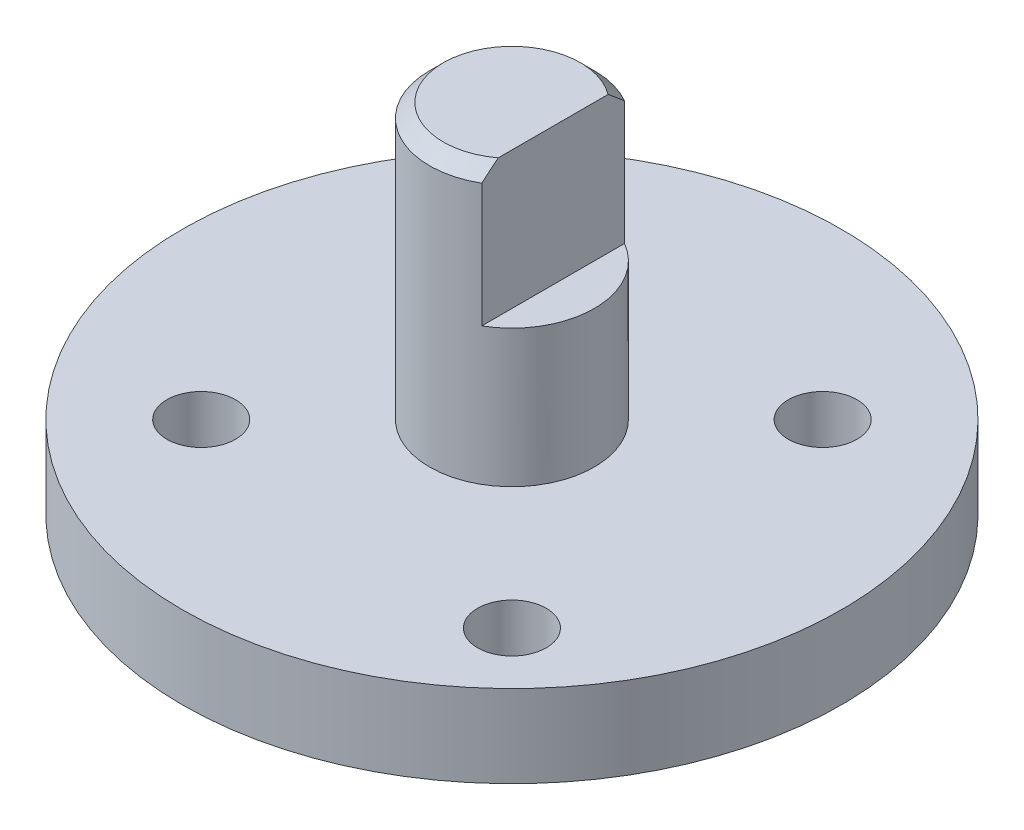
ISO-10303-21;
HEADER;
FILE_DESCRIPTION(('STEP AP214'),'2;1');
FILE_NAME('part.step','',(''),(''),'','','');
FILE_SCHEMA(('AUTOMOTIVE_DESIGN { 1 0 10303 214 1 1 1 1 }'));
ENDSEC;
DATA;
#1=APPLICATION_CONTEXT('core data for automotive mechanical design processes');
#2=APPLICATION_PROTOCOL_DEFINITION('international standard','automotive_design',2000,#1);
#3=PRODUCT_CONTEXT('',#1,'mechanical');
#4=PRODUCT('Part','Part','',(#3));
#5=PRODUCT_RELATED_PRODUCT_CATEGORY('part','',(#4));
#6=PRODUCT_DEFINITION_FORMATION('','',#4);
#7=PRODUCT_DEFINITION_CONTEXT('part definition',#1,'design');
#8=PRODUCT_DEFINITION('design','',#6,#7);
#9=PRODUCT_DEFINITION_SHAPE('','',#8);
#10=(LENGTH_UNIT() NAMED_UNIT(*) SI_UNIT(.MILLI.,.METRE.));
#11=(NAMED_UNIT(*) PLANE_ANGLE_UNIT() SI_UNIT($,.RADIAN.));
#12=(NAMED_UNIT(*) SI_UNIT($,.STERADIAN.) SOLID_ANGLE_UNIT());
#13=UNCERTAINTY_MEASURE_WITH_UNIT(LENGTH_MEASURE(1.E-05),#10,'distance_accuracy_value','');
#14=(GEOMETRIC_REPRESENTATION_CONTEXT(3) GLOBAL_UNCERTAINTY_ASSIGNED_CONTEXT((#13)) GLOBAL_UNIT_ASSIGNED_CONTEXT((#10,
#11,#12)) REPRESENTATION_CONTEXT('',''));
#15=CARTESIAN_POINT('',(0.,0.,0.));
#16=DIRECTION('',(0.,0.,1.));
#17=DIRECTION('',(1.,0.,0.));
#18=AXIS2_PLACEMENT_3D('',#15,#16,#17);
#19=CARTESIAN_POINT('',(-6.5760930650349,3.,-6.57609306503488));
#20=DIRECTION('',(0.,-1.,0.));
#21=DIRECTION('',(0.,0.,-1.));
#22=AXIS2_PLACEMENT_3D('',#19,#20,#21);
#23=CYLINDRICAL_SURFACE('',#22,1.25);
#24=CARTESIAN_POINT('',(-6.5760930650349,3.,-6.57609306503488));
#25=DIRECTION('',(0.,1.,0.));
#26=DIRECTION('',(0.,0.,1.));
#27=AXIS2_PLACEMENT_3D('',#24,#25,#26);
#28=CIRCLE('',#27,1.25);
#29=CARTESIAN_POINT('',(-6.5760930650349,3.,-5.32609306503488));
#30=VERTEX_POINT('',#29);
#31=EDGE_CURVE('E127',#30,#30,#28,.T.);
#32=ORIENTED_EDGE('',*,*,#31,.T.);
#33=EDGE_LOOP('',(#32));
#34=FACE_BOUND('',#33,.T.);
#35=CARTESIAN_POINT('',(-6.5760930650349,0.,-6.57609306503488));
#36=DIRECTION('',(0.,1.,0.));
#37=DIRECTION('',(0.,0.,1.));
#38=AXIS2_PLACEMENT_3D('',#35,#36,#37);
#39=CIRCLE('',#38,1.25);
#40=CARTESIAN_POINT('',(-6.5760930650349,0.,-5.32609306503488));
#41=VERTEX_POINT('',#40);
#42=EDGE_CURVE('E144',#41,#41,#39,.T.);
#43=ORIENTED_EDGE('',*,*,#42,.F.);
#44=EDGE_LOOP('',(#43));
#45=FACE_BOUND('',#44,.T.);
#46=ADVANCED_FACE('F47',(#34,#45),#23,.F.);
#47=CARTESIAN_POINT('',(5.65685424949237,3.,-5.65685424949239));
#48=DIRECTION('',(0.,-1.,0.));
#49=DIRECTION('',(0.,0.,-1.));
#50=AXIS2_PLACEMENT_3D('',#47,#48,#49);
#51=CYLINDRICAL_SURFACE('',#50,1.25);
#52=CARTESIAN_POINT('',(5.65685424949237,3.,-5.65685424949239));
#53=DIRECTION('',(0.,1.,0.));
#54=DIRECTION('',(0.,0.,1.));
#55=AXIS2_PLACEMENT_3D('',#52,#53,#54);
#56=CIRCLE('',#55,1.25);
#57=CARTESIAN_POINT('',(5.65685424949237,3.,-4.40685424949239));
#58=VERTEX_POINT('',#57);
#59=EDGE_CURVE('E125',#58,#58,#56,.T.);
#60=ORIENTED_EDGE('',*,*,#59,.T.);
#61=EDGE_LOOP('',(#60));
#62=FACE_BOUND('',#61,.T.);
#63=CARTESIAN_POINT('',(5.65685424949237,0.,-5.65685424949239));
#64=DIRECTION('',(0.,1.,0.));
#65=DIRECTION('',(0.,0.,1.));
#66=AXIS2_PLACEMENT_3D('',#63,#64,#65);
#67=CIRCLE('',#66,1.25);
#68=CARTESIAN_POINT('',(5.65685424949237,0.,-4.40685424949239));
#69=VERTEX_POINT('',#68);
#70=EDGE_CURVE('E139',#69,#69,#67,.T.);
#71=ORIENTED_EDGE('',*,*,#70,.F.);
#72=EDGE_LOOP('',(#71));
#73=FACE_BOUND('',#72,.T.);
#74=ADVANCED_FACE('F192',(#62,#73),#51,.F.);
#75=CARTESIAN_POINT('',(6.57609306503491,3.,6.57609306503488));
#76=DIRECTION('',(0.,-1.,0.));
#77=DIRECTION('',(0.,0.,-1.));
#78=AXIS2_PLACEMENT_3D('',#75,#76,#77);
#79=CYLINDRICAL_SURFACE('',#78,1.25);
#80=CARTESIAN_POINT('',(6.57609306503491,3.,6.57609306503488));
#81=DIRECTION('',(0.,1.,0.));
#82=DIRECTION('',(0.,0.,1.));
#83=AXIS2_PLACEMENT_3D('',#80,#81,#82);
#84=CIRCLE('',#83,1.25);
#85=CARTESIAN_POINT('',(6.57609306503491,3.,7.82609306503488));
#86=VERTEX_POINT('',#85);
#87=EDGE_CURVE('E120',#86,#86,#84,.T.);
#88=ORIENTED_EDGE('',*,*,#87,.T.);
#89=EDGE_LOOP('',(#88));
#90=FACE_BOUND('',#89,.T.);
#91=CARTESIAN_POINT('',(6.57609306503491,0.,6.57609306503488));
#92=DIRECTION('',(0.,1.,0.));
#93=DIRECTION('',(0.,0.,1.));
#94=AXIS2_PLACEMENT_3D('',#91,#92,#93);
#95=CIRCLE('',#94,1.25);
#96=CARTESIAN_POINT('',(6.57609306503491,0.,7.82609306503488));
#97=VERTEX_POINT('',#96);
#98=EDGE_CURVE('E136',#97,#97,#95,.T.);
#99=ORIENTED_EDGE('',*,*,#98,.F.);
#100=EDGE_LOOP('',(#99));
#101=FACE_BOUND('',#100,.T.);
#102=ADVANCED_FACE('F193',(#90,#101),#79,.F.);
#103=CARTESIAN_POINT('',(-5.65685424949237,3.,5.65685424949239));
#104=DIRECTION('',(0.,-1.,0.));
#105=DIRECTION('',(0.,0.,-1.));
#106=AXIS2_PLACEMENT_3D('',#103,#104,#105);
#107=CYLINDRICAL_SURFACE('',#106,1.25);
#108=CARTESIAN_POINT('',(-5.65685424949237,3.,5.65685424949239));
#109=DIRECTION('',(0.,1.,0.));
#110=DIRECTION('',(0.,0.,1.));
#111=AXIS2_PLACEMENT_3D('',#108,#109,#110);
#112=CIRCLE('',#111,1.25);
#113=CARTESIAN_POINT('',(-5.65685424949237,3.,6.90685424949239));
#114=VERTEX_POINT('',#113);
#115=EDGE_CURVE('E113',#114,#114,#112,.T.);
#116=ORIENTED_EDGE('',*,*,#115,.T.);
#117=EDGE_LOOP('',(#116));
#118=FACE_BOUND('',#117,.T.);
#119=CARTESIAN_POINT('',(-5.65685424949237,0.,5.65685424949239));
#120=DIRECTION('',(0.,1.,0.));
#121=DIRECTION('',(0.,0.,1.));
#122=AXIS2_PLACEMENT_3D('',#119,#120,#121);
#123=CIRCLE('',#122,1.25);
#124=CARTESIAN_POINT('',(-5.65685424949237,0.,6.90685424949239));
#125=VERTEX_POINT('',#124);
#126=EDGE_CURVE('E101',#125,#125,#123,.T.);
#127=ORIENTED_EDGE('',*,*,#126,.F.);
#128=EDGE_LOOP('',(#127));
#129=FACE_BOUND('',#128,.T.);
#130=ADVANCED_FACE('F190',(#118,#129),#107,.F.);
#131=CARTESIAN_POINT('',(0.,3.,0.));
#132=DIRECTION('',(0.,-1.,0.));
#133=DIRECTION('',(0.,0.,-1.));
#134=AXIS2_PLACEMENT_3D('',#131,#132,#133);
#135=CYLINDRICAL_SURFACE('',#134,12.);
#136=CARTESIAN_POINT('',(0.,3.,0.));
#137=DIRECTION('',(0.,1.,0.));
#138=DIRECTION('',(0.,0.,1.));
#139=AXIS2_PLACEMENT_3D('',#136,#137,#138);
#140=CIRCLE('',#139,12.);
#141=CARTESIAN_POINT('',(0.,3.,12.));
#142=VERTEX_POINT('',#141);
#143=EDGE_CURVE('E115',#142,#142,#140,.T.);
#144=ORIENTED_EDGE('',*,*,#143,.F.);
#145=EDGE_LOOP('',(#144));
#146=FACE_BOUND('',#145,.T.);
#147=CARTESIAN_POINT('',(0.,0.,0.));
#148=DIRECTION('',(0.,1.,0.));
#149=DIRECTION('',(0.,0.,1.));
#150=AXIS2_PLACEMENT_3D('',#147,#148,#149);
#151=CIRCLE('',#150,12.);
#152=CARTESIAN_POINT('',(0.,0.,12.));
#153=VERTEX_POINT('',#152);
#154=EDGE_CURVE('E117',#153,#153,#151,.T.);
#155=ORIENTED_EDGE('',*,*,#154,.T.);
#156=EDGE_LOOP('',(#155));
#157=FACE_BOUND('',#156,.T.);
#158=ADVANCED_FACE('F179',(#146,#157),#135,.T.);
#159=CARTESIAN_POINT('',(0.,3.,0.));
#160=DIRECTION('',(0.,1.,0.));
#161=DIRECTION('',(0.,0.,1.));
#162=AXIS2_PLACEMENT_3D('',#159,#160,#161);
#163=PLANE('',#162);
#164=CARTESIAN_POINT('',(0.,3.,0.));
#165=DIRECTION('',(0.,1.,0.));
#166=DIRECTION('',(0.,0.,1.));
#167=AXIS2_PLACEMENT_3D('',#164,#165,#166);
#168=CIRCLE('',#167,3.);
#169=CARTESIAN_POINT('',(0.,3.,3.));
#170=VERTEX_POINT('',#169);
#171=EDGE_CURVE('E110',#170,#170,#168,.T.);
#172=ORIENTED_EDGE('',*,*,#171,.F.);
#173=EDGE_LOOP('',(#172));
#174=FACE_BOUND('',#173,.T.);
#175=ORIENTED_EDGE('',*,*,#115,.F.);
#176=EDGE_LOOP('',(#175));
#177=FACE_BOUND('',#176,.T.);
#178=ORIENTED_EDGE('',*,*,#87,.F.);
#179=EDGE_LOOP('',(#178));
#180=FACE_BOUND('',#179,.T.);
#181=ORIENTED_EDGE('',*,*,#59,.F.);
#182=EDGE_LOOP('',(#181));
#183=FACE_BOUND('',#182,.T.);
#184=ORIENTED_EDGE('',*,*,#31,.F.);
#185=EDGE_LOOP('',(#184));
#186=FACE_BOUND('',#185,.T.);
#187=ORIENTED_EDGE('',*,*,#143,.T.);
#188=EDGE_LOOP('',(#187));
#189=FACE_BOUND('',#188,.T.);
#190=ADVANCED_FACE('F180',(#174,#177,#180,#183,#186,#189),#163,.T.);
#191=CARTESIAN_POINT('',(0.,0.,0.));
#192=DIRECTION('',(0.,1.,0.));
#193=DIRECTION('',(0.,0.,1.));
#194=AXIS2_PLACEMENT_3D('',#191,#192,#193);
#195=PLANE('',#194);
#196=ORIENTED_EDGE('',*,*,#126,.T.);
#197=EDGE_LOOP('',(#196));
#198=FACE_BOUND('',#197,.T.);
#199=ORIENTED_EDGE('',*,*,#98,.T.);
#200=EDGE_LOOP('',(#199));
#201=FACE_BOUND('',#200,.T.);
#202=ORIENTED_EDGE('',*,*,#70,.T.);
#203=EDGE_LOOP('',(#202));
#204=FACE_BOUND('',#203,.T.);
#205=ORIENTED_EDGE('',*,*,#42,.T.);
#206=EDGE_LOOP('',(#205));
#207=FACE_BOUND('',#206,.T.);
#208=ORIENTED_EDGE('',*,*,#154,.F.);
#209=EDGE_LOOP('',(#208));
#210=FACE_BOUND('',#209,.T.);
#211=ADVANCED_FACE('F176',(#198,#201,#204,#207,#210),#195,.F.);
#212=CARTESIAN_POINT('',(0.,13.,0.));
#213=DIRECTION('',(0.,-1.,0.));
#214=DIRECTION('',(0.,0.,-1.));
#215=AXIS2_PLACEMENT_3D('',#212,#213,#214);
#216=CYLINDRICAL_SURFACE('',#215,3.);
#217=DIRECTION('',(0.,1.,0.));
#218=VECTOR('',#217,1.);
#219=CARTESIAN_POINT('',(1.5,8.,2.59807621135332));
#220=LINE('',#219,#218);
#221=CARTESIAN_POINT('',(1.5,8.,2.59807621135332));
#222=VERTEX_POINT('',#221);
#223=CARTESIAN_POINT('',(1.5,12.5,2.59807621135332));
#224=VERTEX_POINT('',#223);
#225=EDGE_CURVE('E94',#222,#224,#220,.T.);
#226=ORIENTED_EDGE('',*,*,#225,.T.);
#227=CARTESIAN_POINT('',(0.,12.5,0.));
#228=DIRECTION('',(0.,1.,0.));
#229=DIRECTION('',(0.,0.,1.));
#230=AXIS2_PLACEMENT_3D('',#227,#228,#229);
#231=CIRCLE('',#230,3.);
#232=CARTESIAN_POINT('',(1.5,12.5,-2.59807621135332));
#233=VERTEX_POINT('',#232);
#234=EDGE_CURVE('E11',#224,#233,#231,.F.);
#235=ORIENTED_EDGE('',*,*,#234,.T.);
#236=DIRECTION('',(0.,1.,0.));
#237=VECTOR('',#236,1.);
#238=CARTESIAN_POINT('',(1.5,8.,-2.59807621135332));
#239=LINE('',#238,#237);
#240=CARTESIAN_POINT('',(1.5,8.,-2.59807621135332));
#241=VERTEX_POINT('',#240);
#242=EDGE_CURVE('E93',#241,#233,#239,.T.);
#243=ORIENTED_EDGE('',*,*,#242,.F.);
#244=CARTESIAN_POINT('',(0.,8.,0.));
#245=DIRECTION('',(0.,1.,0.));
#246=DIRECTION('',(0.,0.,1.));
#247=AXIS2_PLACEMENT_3D('',#244,#245,#246);
#248=CIRCLE('',#247,3.);
#249=EDGE_CURVE('E83',#222,#241,#248,.T.);
#250=ORIENTED_EDGE('',*,*,#249,.F.);
#251=EDGE_LOOP('',(#226,#235,#243,#250));
#252=FACE_BOUND('',#251,.T.);
#253=ORIENTED_EDGE('',*,*,#171,.T.);
#254=EDGE_LOOP('',(#253));
#255=FACE_BOUND('',#254,.T.);
#256=ADVANCED_FACE('F96',(#252,#255),#216,.T.);
#257=CARTESIAN_POINT('',(0.,13.,0.));
#258=DIRECTION('',(0.,1.,0.));
#259=DIRECTION('',(0.,0.,1.));
#260=AXIS2_PLACEMENT_3D('',#257,#258,#259);
#261=PLANE('',#260);
#262=DIRECTION('',(0.,0.,1.));
#263=VECTOR('',#262,1.);
#264=CARTESIAN_POINT('',(1.5,13.,-2.59807621135332));
#265=LINE('',#264,#263);
#266=CARTESIAN_POINT('',(1.5,13.,-2.00000000000001));
#267=VERTEX_POINT('',#266);
#268=CARTESIAN_POINT('',(1.5,13.,2.00000000000001));
#269=VERTEX_POINT('',#268);
#270=EDGE_CURVE('E88',#267,#269,#265,.T.);
#271=ORIENTED_EDGE('',*,*,#270,.F.);
#272=CARTESIAN_POINT('',(0.,13.,0.));
#273=DIRECTION('',(0.,1.,0.));
#274=DIRECTION('',(0.,0.,1.));
#275=AXIS2_PLACEMENT_3D('',#272,#273,#274);
#276=CIRCLE('',#275,2.50000000000001);
#277=EDGE_CURVE('E111',#267,#269,#276,.T.);
#278=ORIENTED_EDGE('',*,*,#277,.T.);
#279=EDGE_LOOP('',(#271,#278));
#280=FACE_BOUND('',#279,.T.);
#281=ADVANCED_FACE('F169',(#280),#261,.T.);
#282=CARTESIAN_POINT('',(1.5,8.,-2.59807621135332));
#283=DIRECTION('',(-1.,0.,0.));
#284=DIRECTION('',(0.,0.,1.));
#285=AXIS2_PLACEMENT_3D('',#282,#283,#284);
#286=PLANE('',#285);
#287=ORIENTED_EDGE('',*,*,#270,.T.);
#288=CARTESIAN_POINT('',(1.5,13.,2.00000000000001));
#289=CARTESIAN_POINT('',(1.5,12.9594091541126,2.05073096834371));
#290=CARTESIAN_POINT('',(1.5,12.9184877796223,2.10119559346293));
#291=CARTESIAN_POINT('',(1.5,12.8360826364181,2.20165596476533));
#292=CARTESIAN_POINT('',(1.5,12.7945989205613,2.25165175427951));
#293=CARTESIAN_POINT('',(1.5,12.7111611597559,2.35124649520412));
#294=CARTESIAN_POINT('',(1.5,12.6692071262861,2.40084545624944));
#295=CARTESIAN_POINT('',(1.5,12.5848914399475,2.49970382878964));
#296=CARTESIAN_POINT('',(1.5,12.5425297494666,2.54896320821956));
#297=CARTESIAN_POINT('',(1.5,12.5000000000001,2.59807621135341));
#298=B_SPLINE_CURVE_WITH_KNOTS('',3,(#288,#289,#290,#291,#292,#293,#294,#295,#296,#297),
.UNSPECIFIED.,.F.,.F.,(4,2,2,2,4),(0.,0.19490989935578,0.389801603489043,0.584688561258782,
0.779593675856244),.UNSPECIFIED.);
#299=EDGE_CURVE('E58',#269,#224,#298,.T.);
#300=ORIENTED_EDGE('',*,*,#299,.T.);
#301=ORIENTED_EDGE('',*,*,#225,.F.);
#302=DIRECTION('',(0.,0.,1.));
#303=VECTOR('',#302,1.);
#304=CARTESIAN_POINT('',(1.5,8.,-2.59807621135332));
#305=LINE('',#304,#303);
#306=EDGE_CURVE('E89',#241,#222,#305,.T.);
#307=ORIENTED_EDGE('',*,*,#306,.F.);
#308=ORIENTED_EDGE('',*,*,#242,.T.);
#309=CARTESIAN_POINT('',(1.5,12.5,-2.59807621135332));
#310=CARTESIAN_POINT('',(1.5,12.5425297494665,-2.54896320821952));
#311=CARTESIAN_POINT('',(1.5,12.5848914399475,-2.49970382878963));
#312=CARTESIAN_POINT('',(1.5,12.6692071262861,-2.40084545624945));
#313=CARTESIAN_POINT('',(1.5,12.7111611597559,-2.35124649520413));
#314=CARTESIAN_POINT('',(1.5,12.7945989205613,-2.2516517542795));
#315=CARTESIAN_POINT('',(1.5,12.836082636418,-2.20165596476531));
#316=CARTESIAN_POINT('',(1.5,12.9184877796224,-2.10119559346297));
#317=CARTESIAN_POINT('',(1.5,12.9594091541128,-2.05073096834383));
#318=CARTESIAN_POINT('',(1.5,13.0000000000004,-2.00000000000031));
#319=B_SPLINE_CURVE_WITH_KNOTS('',3,(#309,#310,#311,#312,#313,#314,#315,#316,#317,#318),
.UNSPECIFIED.,.F.,.F.,(4,2,2,2,4),(0.,0.194905114597463,0.389792072367201,0.584683776500458,
0.779593675856233),.UNSPECIFIED.);
#320=EDGE_CURVE('E151',#233,#267,#319,.T.);
#321=ORIENTED_EDGE('',*,*,#320,.T.);
#322=EDGE_LOOP('',(#287,#300,#301,#307,#308,#321));
#323=FACE_BOUND('',#322,.T.);
#324=ADVANCED_FACE('F95',(#323),#286,.F.);
#325=CARTESIAN_POINT('',(0.,8.,0.));
#326=DIRECTION('',(0.,1.,0.));
#327=DIRECTION('',(0.,0.,1.));
#328=AXIS2_PLACEMENT_3D('',#325,#326,#327);
#329=PLANE('',#328);
#330=ORIENTED_EDGE('',*,*,#249,.T.);
#331=ORIENTED_EDGE('',*,*,#306,.T.);
#332=EDGE_LOOP('',(#330,#331));
#333=FACE_BOUND('',#332,.T.);
#334=ADVANCED_FACE('F90',(#333),#329,.T.);
#335=CARTESIAN_POINT('',(0.,13.,0.));
#336=DIRECTION('',(0.,-1.,0.));
#337=DIRECTION('',(0.,0.,-1.));
#338=AXIS2_PLACEMENT_3D('',#335,#336,#337);
#339=CONICAL_SURFACE('',#338,2.50000000000001,0.785398163397448);
#340=ORIENTED_EDGE('',*,*,#320,.F.);
#341=ORIENTED_EDGE('',*,*,#234,.F.);
#342=ORIENTED_EDGE('',*,*,#299,.F.);
#343=ORIENTED_EDGE('',*,*,#277,.F.);
#344=EDGE_LOOP('',(#340,#341,#342,#343));
#345=FACE_BOUND('',#344,.T.);
#346=ADVANCED_FACE('F55',(#345),#339,.T.);
#347=CLOSED_SHELL('',(#46,#74,#102,#130,#158,#190,#211,#256,#281,#324,#334,#346));
#348=MANIFOLD_SOLID_BREP('B2',#347);
#349=ADVANCED_BREP_SHAPE_REPRESENTATION('',(#18,#348),#14);
#350=SHAPE_DEFINITION_REPRESENTATION(#9,#349);
ENDSEC;
END-ISO-10303-21;
